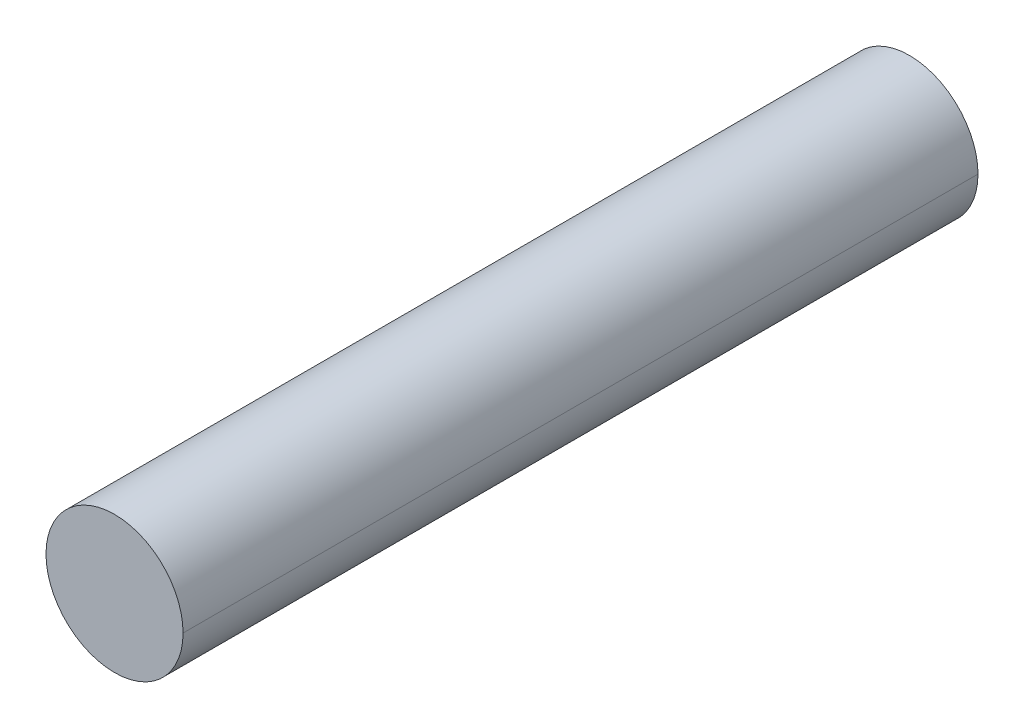
ISO-10303-21;
HEADER;
FILE_DESCRIPTION(('STEP AP214'),'2;1');
FILE_NAME('part.step','',(''),(''),'','','');
FILE_SCHEMA(('AUTOMOTIVE_DESIGN { 1 0 10303 214 1 1 1 1 }'));
ENDSEC;
DATA;
#1=APPLICATION_CONTEXT('core data for automotive mechanical design processes');
#2=APPLICATION_PROTOCOL_DEFINITION('international standard','automotive_design',2000,#1);
#3=PRODUCT_CONTEXT('',#1,'mechanical');
#4=PRODUCT('Part','Part','',(#3));
#5=PRODUCT_RELATED_PRODUCT_CATEGORY('part','',(#4));
#6=PRODUCT_DEFINITION_FORMATION('','',#4);
#7=PRODUCT_DEFINITION_CONTEXT('part definition',#1,'design');
#8=PRODUCT_DEFINITION('design','',#6,#7);
#9=PRODUCT_DEFINITION_SHAPE('','',#8);
#10=(LENGTH_UNIT() NAMED_UNIT(*) SI_UNIT(.MILLI.,.METRE.));
#11=(NAMED_UNIT(*) PLANE_ANGLE_UNIT() SI_UNIT($,.RADIAN.));
#12=(NAMED_UNIT(*) SI_UNIT($,.STERADIAN.) SOLID_ANGLE_UNIT());
#13=UNCERTAINTY_MEASURE_WITH_UNIT(LENGTH_MEASURE(1.E-05),#10,'distance_accuracy_value','');
#14=(GEOMETRIC_REPRESENTATION_CONTEXT(3) GLOBAL_UNCERTAINTY_ASSIGNED_CONTEXT((#13)) GLOBAL_UNIT_ASSIGNED_CONTEXT((#10,
#11,#12)) REPRESENTATION_CONTEXT('',''));
#15=CARTESIAN_POINT('',(0.,0.,0.));
#16=DIRECTION('',(0.,0.,1.));
#17=DIRECTION('',(1.,0.,0.));
#18=AXIS2_PLACEMENT_3D('',#15,#16,#17);
#19=CARTESIAN_POINT('',(0.,0.,9.2075));
#20=DIRECTION('',(0.,0.,-1.));
#21=DIRECTION('',(-1.,0.,0.));
#22=AXIS2_PLACEMENT_3D('',#19,#20,#21);
#23=CYLINDRICAL_SURFACE('',#22,1.5875);
#24=CARTESIAN_POINT('',(0.,0.,9.2075));
#25=DIRECTION('',(0.,0.,1.));
#26=DIRECTION('',(1.,0.,0.));
#27=AXIS2_PLACEMENT_3D('',#24,#25,#26);
#28=CIRCLE('',#27,1.5875);
#29=CARTESIAN_POINT('',(1.5875,0.,9.2075));
#30=VERTEX_POINT('',#29);
#31=CARTESIAN_POINT('',(-1.5875,0.,9.2075));
#32=VERTEX_POINT('',#31);
#33=EDGE_CURVE('E42',#30,#32,#28,.T.);
#34=ORIENTED_EDGE('',*,*,#33,.F.);
#35=DIRECTION('',(0.,0.,-1.));
#36=VECTOR('',#35,1.);
#37=CARTESIAN_POINT('',(1.5875,0.,9.2075));
#38=LINE('',#37,#36);
#39=CARTESIAN_POINT('',(1.5875,0.,-9.2075));
#40=VERTEX_POINT('',#39);
#41=EDGE_CURVE('E11',#30,#40,#38,.T.);
#42=ORIENTED_EDGE('',*,*,#41,.T.);
#43=CARTESIAN_POINT('',(0.,0.,-9.2075));
#44=DIRECTION('',(0.,0.,1.));
#45=DIRECTION('',(1.,0.,0.));
#46=AXIS2_PLACEMENT_3D('',#43,#44,#45);
#47=CIRCLE('',#46,1.5875);
#48=CARTESIAN_POINT('',(-1.5875,0.,-9.2075));
#49=VERTEX_POINT('',#48);
#50=EDGE_CURVE('E28',#40,#49,#47,.T.);
#51=ORIENTED_EDGE('',*,*,#50,.T.);
#52=DIRECTION('',(0.,0.,-1.));
#53=VECTOR('',#52,1.);
#54=CARTESIAN_POINT('',(-1.5875,0.,9.2075));
#55=LINE('',#54,#53);
#56=EDGE_CURVE('E59',#32,#49,#55,.T.);
#57=ORIENTED_EDGE('',*,*,#56,.F.);
#58=EDGE_LOOP('',(#34,#42,#51,#57));
#59=FACE_BOUND('',#58,.T.);
#60=ADVANCED_FACE('F17',(#59),#23,.T.);
#61=CARTESIAN_POINT('',(0.,0.,9.2075));
#62=DIRECTION('',(0.,0.,-1.));
#63=DIRECTION('',(-1.,0.,0.));
#64=AXIS2_PLACEMENT_3D('',#61,#62,#63);
#65=CYLINDRICAL_SURFACE('',#64,1.5875);
#66=ORIENTED_EDGE('',*,*,#41,.F.);
#67=CARTESIAN_POINT('',(0.,0.,9.2075));
#68=DIRECTION('',(0.,0.,1.));
#69=DIRECTION('',(1.,0.,0.));
#70=AXIS2_PLACEMENT_3D('',#67,#68,#69);
#71=CIRCLE('',#70,1.5875);
#72=EDGE_CURVE('E21',#32,#30,#71,.T.);
#73=ORIENTED_EDGE('',*,*,#72,.F.);
#74=ORIENTED_EDGE('',*,*,#56,.T.);
#75=CARTESIAN_POINT('',(0.,0.,-9.2075));
#76=DIRECTION('',(0.,0.,1.));
#77=DIRECTION('',(1.,0.,0.));
#78=AXIS2_PLACEMENT_3D('',#75,#76,#77);
#79=CIRCLE('',#78,1.5875);
#80=EDGE_CURVE('E63',#49,#40,#79,.T.);
#81=ORIENTED_EDGE('',*,*,#80,.T.);
#82=EDGE_LOOP('',(#66,#73,#74,#81));
#83=FACE_BOUND('',#82,.T.);
#84=ADVANCED_FACE('F61',(#83),#65,.T.);
#85=CARTESIAN_POINT('',(0.,0.,9.2075));
#86=DIRECTION('',(0.,0.,1.));
#87=DIRECTION('',(1.,0.,0.));
#88=AXIS2_PLACEMENT_3D('',#85,#86,#87);
#89=PLANE('',#88);
#90=ORIENTED_EDGE('',*,*,#72,.T.);
#91=ORIENTED_EDGE('',*,*,#33,.T.);
#92=EDGE_LOOP('',(#90,#91));
#93=FACE_BOUND('',#92,.T.);
#94=ADVANCED_FACE('F19',(#93),#89,.T.);
#95=CARTESIAN_POINT('',(0.,0.,-9.2075));
#96=DIRECTION('',(0.,0.,1.));
#97=DIRECTION('',(1.,0.,0.));
#98=AXIS2_PLACEMENT_3D('',#95,#96,#97);
#99=PLANE('',#98);
#100=ORIENTED_EDGE('',*,*,#80,.F.);
#101=ORIENTED_EDGE('',*,*,#50,.F.);
#102=EDGE_LOOP('',(#100,#101));
#103=FACE_BOUND('',#102,.T.);
#104=ADVANCED_FACE('F68',(#103),#99,.F.);
#105=CLOSED_SHELL('',(#60,#84,#94,#104));
#106=MANIFOLD_SOLID_BREP('B1',#105);
#107=ADVANCED_BREP_SHAPE_REPRESENTATION('',(#18,#106),#14);
#108=SHAPE_DEFINITION_REPRESENTATION(#9,#107);
ENDSEC;
END-ISO-10303-21;
